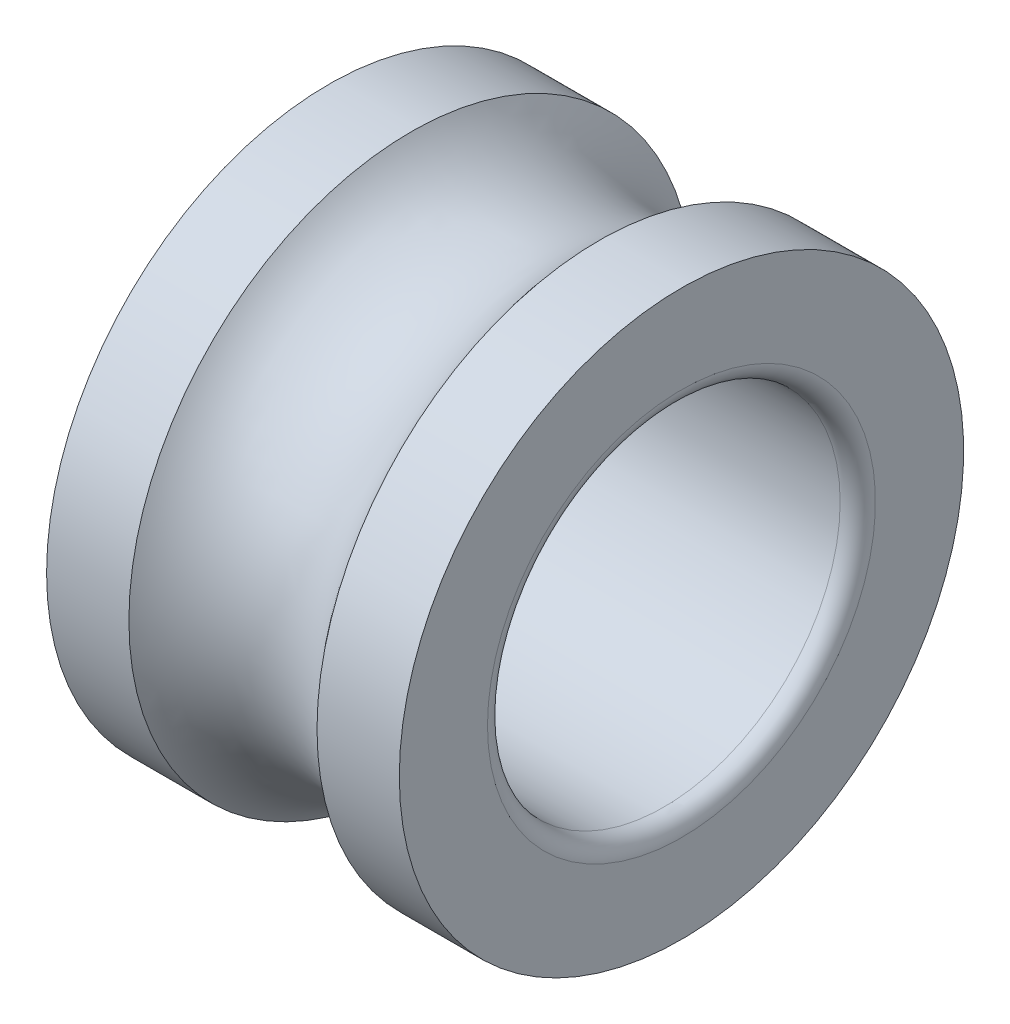
ISO-10303-21;
HEADER;
FILE_DESCRIPTION(('STEP AP214'),'2;1');
FILE_NAME('part.step','',(''),(''),'','','');
FILE_SCHEMA(('AUTOMOTIVE_DESIGN { 1 0 10303 214 1 1 1 1 }'));
ENDSEC;
DATA;
#1=APPLICATION_CONTEXT('core data for automotive mechanical design processes');
#2=APPLICATION_PROTOCOL_DEFINITION('international standard','automotive_design',2000,#1);
#3=PRODUCT_CONTEXT('',#1,'mechanical');
#4=PRODUCT('Part','Part','',(#3));
#5=PRODUCT_RELATED_PRODUCT_CATEGORY('part','',(#4));
#6=PRODUCT_DEFINITION_FORMATION('','',#4);
#7=PRODUCT_DEFINITION_CONTEXT('part definition',#1,'design');
#8=PRODUCT_DEFINITION('design','',#6,#7);
#9=PRODUCT_DEFINITION_SHAPE('','',#8);
#10=(LENGTH_UNIT() NAMED_UNIT(*) SI_UNIT(.MILLI.,.METRE.));
#11=(NAMED_UNIT(*) PLANE_ANGLE_UNIT() SI_UNIT($,.RADIAN.));
#12=(NAMED_UNIT(*) SI_UNIT($,.STERADIAN.) SOLID_ANGLE_UNIT());
#13=UNCERTAINTY_MEASURE_WITH_UNIT(LENGTH_MEASURE(1.E-05),#10,'distance_accuracy_value','');
#14=(GEOMETRIC_REPRESENTATION_CONTEXT(3) GLOBAL_UNCERTAINTY_ASSIGNED_CONTEXT((#13)) GLOBAL_UNIT_ASSIGNED_CONTEXT((#10,
#11,#12)) REPRESENTATION_CONTEXT('',''));
#15=CARTESIAN_POINT('',(0.,0.,0.));
#16=DIRECTION('',(0.,0.,1.));
#17=DIRECTION('',(1.,0.,0.));
#18=AXIS2_PLACEMENT_3D('',#15,#16,#17);
#19=CARTESIAN_POINT('',(0.,0.,0.));
#20=DIRECTION('',(-1.,0.,0.));
#21=DIRECTION('',(0.,0.,1.));
#22=AXIS2_PLACEMENT_3D('',#19,#20,#21);
#23=CYLINDRICAL_SURFACE('',#22,3.2);
#24=CARTESIAN_POINT('',(0.,0.,0.));
#25=DIRECTION('',(-1.,0.,0.));
#26=DIRECTION('',(0.,0.,1.));
#27=AXIS2_PLACEMENT_3D('',#24,#25,#26);
#28=CIRCLE('',#27,3.2);
#29=CARTESIAN_POINT('',(0.,0.,3.2));
#30=VERTEX_POINT('',#29);
#31=EDGE_CURVE('E10',#30,#30,#28,.T.);
#32=ORIENTED_EDGE('',*,*,#31,.F.);
#33=EDGE_LOOP('',(#32));
#34=FACE_BOUND('',#33,.T.);
#35=CARTESIAN_POINT('',(0.933333333333333,0.,0.));
#36=DIRECTION('',(-1.,0.,0.));
#37=DIRECTION('',(0.,0.,1.));
#38=AXIS2_PLACEMENT_3D('',#35,#36,#37);
#39=CIRCLE('',#38,3.2);
#40=CARTESIAN_POINT('',(0.933333333333333,0.,3.2));
#41=VERTEX_POINT('',#40);
#42=EDGE_CURVE('E56',#41,#41,#39,.T.);
#43=ORIENTED_EDGE('',*,*,#42,.T.);
#44=EDGE_LOOP('',(#43));
#45=FACE_BOUND('',#44,.T.);
#46=ADVANCED_FACE('F14',(#34,#45),#23,.T.);
#47=CARTESIAN_POINT('',(0.,3.2,0.));
#48=DIRECTION('',(1.,0.,0.));
#49=DIRECTION('',(0.,0.,-1.));
#50=AXIS2_PLACEMENT_3D('',#47,#48,#49);
#51=PLANE('',#50);
#52=CARTESIAN_POINT('',(0.,0.,0.));
#53=DIRECTION('',(-1.,0.,0.));
#54=DIRECTION('',(0.,0.,1.));
#55=AXIS2_PLACEMENT_3D('',#52,#53,#54);
#56=CIRCLE('',#55,2.2);
#57=CARTESIAN_POINT('',(0.,0.,2.2));
#58=VERTEX_POINT('',#57);
#59=EDGE_CURVE('E21',#58,#58,#56,.T.);
#60=ORIENTED_EDGE('',*,*,#59,.F.);
#61=EDGE_LOOP('',(#60));
#62=FACE_BOUND('',#61,.T.);
#63=ORIENTED_EDGE('',*,*,#31,.T.);
#64=EDGE_LOOP('',(#63));
#65=FACE_BOUND('',#64,.T.);
#66=ADVANCED_FACE('F75',(#62,#65),#51,.F.);
#67=CARTESIAN_POINT('',(0.2,0.,0.));
#68=DIRECTION('',(-1.,0.,0.));
#69=DIRECTION('',(0.,0.,1.));
#70=AXIS2_PLACEMENT_3D('',#67,#68,#69);
#71=TOROIDAL_SURFACE('',#70,2.2,0.2);
#72=CARTESIAN_POINT('',(0.2,0.,0.));
#73=DIRECTION('',(-1.,0.,0.));
#74=DIRECTION('',(0.,0.,1.));
#75=AXIS2_PLACEMENT_3D('',#72,#73,#74);
#76=CIRCLE('',#75,2.);
#77=CARTESIAN_POINT('',(0.2,0.,2.));
#78=VERTEX_POINT('',#77);
#79=EDGE_CURVE('E30',#78,#78,#76,.T.);
#80=ORIENTED_EDGE('',*,*,#79,.F.);
#81=EDGE_LOOP('',(#80));
#82=FACE_BOUND('',#81,.T.);
#83=ORIENTED_EDGE('',*,*,#59,.T.);
#84=EDGE_LOOP('',(#83));
#85=FACE_BOUND('',#84,.T.);
#86=ADVANCED_FACE('F80',(#82,#85),#71,.T.);
#87=CARTESIAN_POINT('',(0.,0.,0.));
#88=DIRECTION('',(-1.,0.,0.));
#89=DIRECTION('',(0.,0.,1.));
#90=AXIS2_PLACEMENT_3D('',#87,#88,#89);
#91=CYLINDRICAL_SURFACE('',#90,2.);
#92=CARTESIAN_POINT('',(3.8,0.,0.));
#93=DIRECTION('',(-1.,0.,0.));
#94=DIRECTION('',(0.,0.,1.));
#95=AXIS2_PLACEMENT_3D('',#92,#93,#94);
#96=CIRCLE('',#95,2.);
#97=CARTESIAN_POINT('',(3.8,0.,2.));
#98=VERTEX_POINT('',#97);
#99=EDGE_CURVE('E38',#98,#98,#96,.T.);
#100=ORIENTED_EDGE('',*,*,#99,.F.);
#101=EDGE_LOOP('',(#100));
#102=FACE_BOUND('',#101,.T.);
#103=ORIENTED_EDGE('',*,*,#79,.T.);
#104=EDGE_LOOP('',(#103));
#105=FACE_BOUND('',#104,.T.);
#106=ADVANCED_FACE('F85',(#102,#105),#91,.F.);
#107=CARTESIAN_POINT('',(3.8,0.,0.));
#108=DIRECTION('',(-1.,0.,0.));
#109=DIRECTION('',(0.,0.,1.));
#110=AXIS2_PLACEMENT_3D('',#107,#108,#109);
#111=TOROIDAL_SURFACE('',#110,2.2,0.2);
#112=CARTESIAN_POINT('',(4.,0.,0.));
#113=DIRECTION('',(-1.,0.,0.));
#114=DIRECTION('',(0.,0.,1.));
#115=AXIS2_PLACEMENT_3D('',#112,#113,#114);
#116=CIRCLE('',#115,2.2);
#117=CARTESIAN_POINT('',(4.,0.,2.2));
#118=VERTEX_POINT('',#117);
#119=EDGE_CURVE('E44',#118,#118,#116,.T.);
#120=ORIENTED_EDGE('',*,*,#119,.F.);
#121=EDGE_LOOP('',(#120));
#122=FACE_BOUND('',#121,.T.);
#123=ORIENTED_EDGE('',*,*,#99,.T.);
#124=EDGE_LOOP('',(#123));
#125=FACE_BOUND('',#124,.T.);
#126=ADVANCED_FACE('F91',(#122,#125),#111,.T.);
#127=CARTESIAN_POINT('',(4.,2.2,0.));
#128=DIRECTION('',(-1.,0.,0.));
#129=DIRECTION('',(0.,0.,1.));
#130=AXIS2_PLACEMENT_3D('',#127,#128,#129);
#131=PLANE('',#130);
#132=CARTESIAN_POINT('',(4.,0.,0.));
#133=DIRECTION('',(-1.,0.,0.));
#134=DIRECTION('',(0.,0.,1.));
#135=AXIS2_PLACEMENT_3D('',#132,#133,#134);
#136=CIRCLE('',#135,3.2);
#137=CARTESIAN_POINT('',(4.,0.,3.2));
#138=VERTEX_POINT('',#137);
#139=EDGE_CURVE('E48',#138,#138,#136,.T.);
#140=ORIENTED_EDGE('',*,*,#139,.F.);
#141=EDGE_LOOP('',(#140));
#142=FACE_BOUND('',#141,.T.);
#143=ORIENTED_EDGE('',*,*,#119,.T.);
#144=EDGE_LOOP('',(#143));
#145=FACE_BOUND('',#144,.T.);
#146=ADVANCED_FACE('F71',(#142,#145),#131,.F.);
#147=CARTESIAN_POINT('',(0.,0.,0.));
#148=DIRECTION('',(-1.,0.,0.));
#149=DIRECTION('',(0.,0.,1.));
#150=AXIS2_PLACEMENT_3D('',#147,#148,#149);
#151=CYLINDRICAL_SURFACE('',#150,3.2);
#152=CARTESIAN_POINT('',(3.06666666666667,0.,0.));
#153=DIRECTION('',(-1.,0.,0.));
#154=DIRECTION('',(0.,0.,1.));
#155=AXIS2_PLACEMENT_3D('',#152,#153,#154);
#156=CIRCLE('',#155,3.2);
#157=CARTESIAN_POINT('',(3.06666666666667,0.,3.2));
#158=VERTEX_POINT('',#157);
#159=EDGE_CURVE('E52',#158,#158,#156,.T.);
#160=ORIENTED_EDGE('',*,*,#159,.F.);
#161=EDGE_LOOP('',(#160));
#162=FACE_BOUND('',#161,.T.);
#163=ORIENTED_EDGE('',*,*,#139,.T.);
#164=EDGE_LOOP('',(#163));
#165=FACE_BOUND('',#164,.T.);
#166=ADVANCED_FACE('F64',(#162,#165),#151,.T.);
#167=CARTESIAN_POINT('',(2.,0.,0.));
#168=DIRECTION('',(-1.,0.,0.));
#169=DIRECTION('',(0.,0.,1.));
#170=AXIS2_PLACEMENT_3D('',#167,#168,#169);
#171=TOROIDAL_SURFACE('',#170,4.,1.33333333333333);
#172=ORIENTED_EDGE('',*,*,#159,.T.);
#173=EDGE_LOOP('',(#172));
#174=FACE_BOUND('',#173,.T.);
#175=ORIENTED_EDGE('',*,*,#42,.F.);
#176=EDGE_LOOP('',(#175));
#177=FACE_BOUND('',#176,.T.);
#178=ADVANCED_FACE('F62',(#174,#177),#171,.F.);
#179=CLOSED_SHELL('',(#46,#66,#86,#106,#126,#146,#166,#178));
#180=MANIFOLD_SOLID_BREP('B1',#179);
#181=ADVANCED_BREP_SHAPE_REPRESENTATION('',(#18,#180),#14);
#182=SHAPE_DEFINITION_REPRESENTATION(#9,#181);
ENDSEC;
END-ISO-10303-21;
